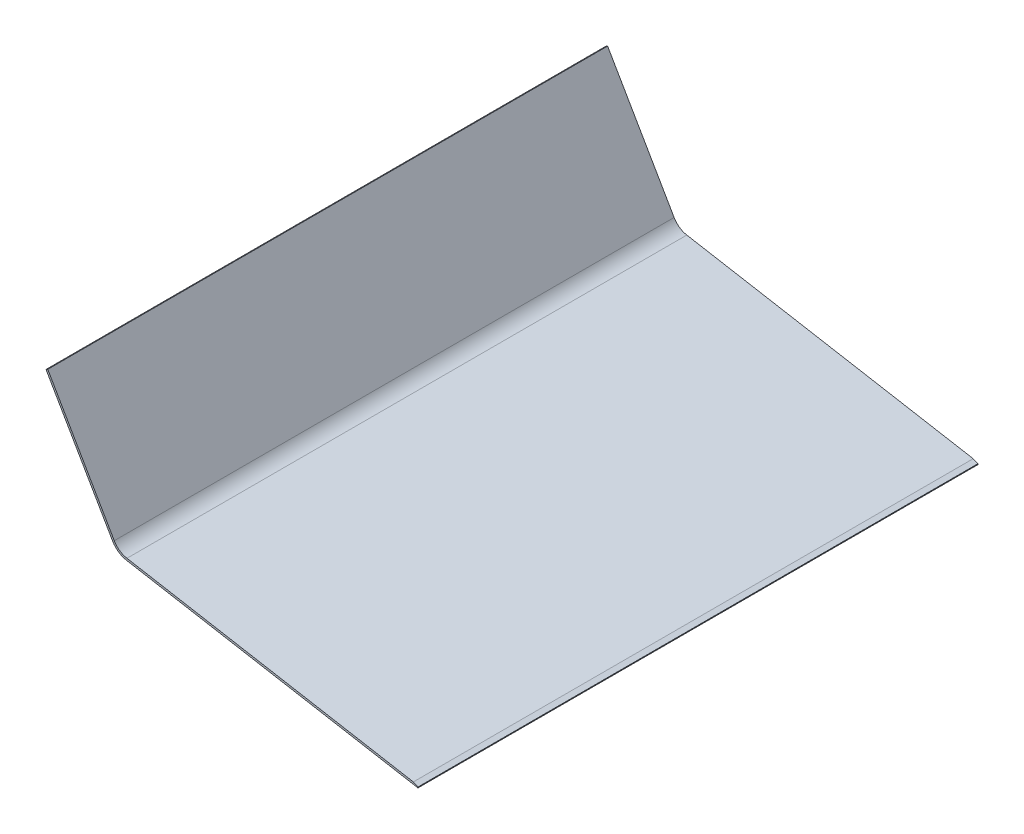
ISO-10303-21;
HEADER;
FILE_DESCRIPTION(('STEP AP214'),'2;1');
FILE_NAME('part.step','',(''),(''),'','','');
FILE_SCHEMA(('AUTOMOTIVE_DESIGN { 1 0 10303 214 1 1 1 1 }'));
ENDSEC;
DATA;
#1=APPLICATION_CONTEXT('core data for automotive mechanical design processes');
#2=APPLICATION_PROTOCOL_DEFINITION('international standard','automotive_design',2000,#1);
#3=PRODUCT_CONTEXT('',#1,'mechanical');
#4=PRODUCT('Part','Part','',(#3));
#5=PRODUCT_RELATED_PRODUCT_CATEGORY('part','',(#4));
#6=PRODUCT_DEFINITION_FORMATION('','',#4);
#7=PRODUCT_DEFINITION_CONTEXT('part definition',#1,'design');
#8=PRODUCT_DEFINITION('design','',#6,#7);
#9=PRODUCT_DEFINITION_SHAPE('','',#8);
#10=(LENGTH_UNIT() NAMED_UNIT(*) SI_UNIT(.MILLI.,.METRE.));
#11=(NAMED_UNIT(*) PLANE_ANGLE_UNIT() SI_UNIT($,.RADIAN.));
#12=(NAMED_UNIT(*) SI_UNIT($,.STERADIAN.) SOLID_ANGLE_UNIT());
#13=UNCERTAINTY_MEASURE_WITH_UNIT(LENGTH_MEASURE(1.E-05),#10,'distance_accuracy_value','');
#14=(GEOMETRIC_REPRESENTATION_CONTEXT(3) GLOBAL_UNCERTAINTY_ASSIGNED_CONTEXT((#13)) GLOBAL_UNIT_ASSIGNED_CONTEXT((#10,
#11,#12)) REPRESENTATION_CONTEXT('',''));
#15=CARTESIAN_POINT('',(0.,0.,0.));
#16=DIRECTION('',(0.,0.,1.));
#17=DIRECTION('',(1.,0.,0.));
#18=AXIS2_PLACEMENT_3D('',#15,#16,#17);
#19=CARTESIAN_POINT('',(365.442325903662,-173.338009829901,0.));
#20=DIRECTION('',(0.984807753012208,-0.173648177666931,0.));
#21=DIRECTION('',(0.,0.,-1.));
#22=AXIS2_PLACEMENT_3D('',#19,#20,#21);
#23=PLANE('',#22);
#24=DIRECTION('',(0.173648177666931,0.984807753012208,0.));
#25=VECTOR('',#24,1.);
#26=CARTESIAN_POINT('',(365.442325903662,-173.338009829901,-550.));
#27=LINE('',#26,#25);
#28=CARTESIAN_POINT('',(365.442325903662,-173.338009829901,-550.));
#29=VERTEX_POINT('',#28);
#30=CARTESIAN_POINT('',(365.615974081329,-172.353202076889,-550.));
#31=VERTEX_POINT('',#30);
#32=EDGE_CURVE('E187',#29,#31,#27,.T.);
#33=ORIENTED_EDGE('',*,*,#32,.T.);
#34=DIRECTION('',(0.,0.,1.));
#35=VECTOR('',#34,1.);
#36=CARTESIAN_POINT('',(365.615974081329,-172.353202076889,0.));
#37=LINE('',#36,#35);
#38=CARTESIAN_POINT('',(365.615974081329,-172.353202076889,0.));
#39=VERTEX_POINT('',#38);
#40=EDGE_CURVE('E49',#31,#39,#37,.T.);
#41=ORIENTED_EDGE('',*,*,#40,.T.);
#42=DIRECTION('',(0.173648177666931,0.984807753012208,0.));
#43=VECTOR('',#42,1.);
#44=CARTESIAN_POINT('',(365.442325903662,-173.338009829901,0.));
#45=LINE('',#44,#43);
#46=CARTESIAN_POINT('',(365.442325903662,-173.338009829901,0.));
#47=VERTEX_POINT('',#46);
#48=EDGE_CURVE('E189',#47,#39,#45,.T.);
#49=ORIENTED_EDGE('',*,*,#48,.F.);
#50=DIRECTION('',(0.,0.,-1.));
#51=VECTOR('',#50,1.);
#52=CARTESIAN_POINT('',(365.442325903662,-173.338009829901,0.));
#53=LINE('',#52,#51);
#54=EDGE_CURVE('E162',#47,#29,#53,.T.);
#55=ORIENTED_EDGE('',*,*,#54,.T.);
#56=EDGE_LOOP('',(#33,#41,#49,#55));
#57=FACE_BOUND('',#56,.T.);
#58=ADVANCED_FACE('F41',(#57),#23,.T.);
#59=CARTESIAN_POINT('',(0.,0.,-550.));
#60=DIRECTION('',(0.,0.,1.));
#61=DIRECTION('',(0.499999999999998,-0.86602540378444,0.));
#62=AXIS2_PLACEMENT_3D('',#59,#60,#61);
#63=PLANE('',#62);
#64=DIRECTION('',(-0.984807753012208,0.173648177666931,0.));
#65=VECTOR('',#64,1.);
#66=CARTESIAN_POINT('',(70.3472963553336,-119.273941023797,-550.));
#67=LINE('',#66,#65);
#68=CARTESIAN_POINT('',(79.5317642961338,-120.893410525212,-550.));
#69=VERTEX_POINT('',#68);
#70=CARTESIAN_POINT('',(360.865583493936,-170.500153435542,-550.));
#71=VERTEX_POINT('',#70);
#72=EDGE_CURVE('E140',#69,#71,#67,.F.);
#73=ORIENTED_EDGE('',*,*,#72,.T.);
#74=DIRECTION('',(0.93162824239654,-0.363412737764012,0.));
#75=VECTOR('',#74,1.);
#76=CARTESIAN_POINT('',(-10.0663906003716,-25.8057376854828,-550.));
#77=LINE('',#76,#75);
#78=EDGE_CURVE('E63',#71,#31,#77,.T.);
#79=ORIENTED_EDGE('',*,*,#78,.T.);
#80=ORIENTED_EDGE('',*,*,#32,.F.);
#81=DIRECTION('',(0.984807753012208,-0.173648177666931,0.));
#82=VECTOR('',#81,1.);
#83=CARTESIAN_POINT('',(69.9999999999997,-121.243556529822,-550.));
#84=LINE('',#83,#82);
#85=CARTESIAN_POINT('',(79.1844679407999,-122.863026031237,-550.));
#86=VERTEX_POINT('',#85);
#87=EDGE_CURVE('E165',#86,#29,#84,.T.);
#88=ORIENTED_EDGE('',*,*,#87,.F.);
#89=CARTESIAN_POINT('',(82.6574314941385,-103.166870970992,-550.));
#90=DIRECTION('',(0.,0.,1.));
#91=DIRECTION('',(1.,0.,0.));
#92=AXIS2_PLACEMENT_3D('',#89,#90,#91);
#93=CIRCLE('',#92,20.);
#94=CARTESIAN_POINT('',(65.3369234184498,-113.166870970992,-550.));
#95=VERTEX_POINT('',#94);
#96=EDGE_CURVE('E180',#86,#95,#93,.F.);
#97=ORIENTED_EDGE('',*,*,#96,.T.);
#98=DIRECTION('',(0.499999999999998,-0.86602540378444,0.));
#99=VECTOR('',#98,1.);
#100=CARTESIAN_POINT('',(0.,0.,-550.));
#101=LINE('',#100,#99);
#102=CARTESIAN_POINT('',(0.,0.,-550.));
#103=VERTEX_POINT('',#102);
#104=EDGE_CURVE('E166',#103,#95,#101,.T.);
#105=ORIENTED_EDGE('',*,*,#104,.F.);
#106=DIRECTION('',(0.86602540378444,0.499999999999998,0.));
#107=VECTOR('',#106,1.);
#108=CARTESIAN_POINT('',(0.,0.,-550.));
#109=LINE('',#108,#107);
#110=CARTESIAN_POINT('',(1.73205080756888,0.999999999999996,-550.));
#111=VERTEX_POINT('',#110);
#112=EDGE_CURVE('E122',#103,#111,#109,.T.);
#113=ORIENTED_EDGE('',*,*,#112,.T.);
#114=DIRECTION('',(-0.499999999999998,0.86602540378444,0.));
#115=VECTOR('',#114,1.);
#116=CARTESIAN_POINT('',(1.73205080756888,0.999999999999996,-550.));
#117=LINE('',#116,#115);
#118=CARTESIAN_POINT('',(67.0689742260186,-112.166870970992,-550.));
#119=VERTEX_POINT('',#118);
#120=EDGE_CURVE('E132',#111,#119,#117,.F.);
#121=ORIENTED_EDGE('',*,*,#120,.T.);
#122=CARTESIAN_POINT('',(82.6574314941385,-103.166870970992,-550.));
#123=DIRECTION('',(0.,0.,1.));
#124=DIRECTION('',(1.,0.,0.));
#125=AXIS2_PLACEMENT_3D('',#122,#123,#124);
#126=CIRCLE('',#125,18.);
#127=EDGE_CURVE('E149',#69,#119,#126,.F.);
#128=ORIENTED_EDGE('',*,*,#127,.F.);
#129=EDGE_LOOP('',(#73,#79,#80,#88,#97,#105,#113,#121,#128));
#130=FACE_BOUND('',#129,.T.);
#131=ADVANCED_FACE('F201',(#130),#63,.F.);
#132=CARTESIAN_POINT('',(0.,0.,0.));
#133=DIRECTION('',(0.499999999999998,-0.86602540378444,0.));
#134=DIRECTION('',(0.,0.,-1.));
#135=AXIS2_PLACEMENT_3D('',#132,#133,#134);
#136=PLANE('',#135);
#137=ORIENTED_EDGE('',*,*,#112,.F.);
#138=DIRECTION('',(0.,0.,-1.));
#139=VECTOR('',#138,1.);
#140=CARTESIAN_POINT('',(0.,0.,0.));
#141=LINE('',#140,#139);
#142=CARTESIAN_POINT('',(0.,0.,0.));
#143=VERTEX_POINT('',#142);
#144=EDGE_CURVE('E117',#143,#103,#141,.T.);
#145=ORIENTED_EDGE('',*,*,#144,.F.);
#146=DIRECTION('',(0.86602540378444,0.499999999999998,0.));
#147=VECTOR('',#146,1.);
#148=CARTESIAN_POINT('',(0.,0.,0.));
#149=LINE('',#148,#147);
#150=CARTESIAN_POINT('',(1.73205080756888,0.999999999999996,0.));
#151=VERTEX_POINT('',#150);
#152=EDGE_CURVE('E112',#143,#151,#149,.T.);
#153=ORIENTED_EDGE('',*,*,#152,.T.);
#154=DIRECTION('',(0.,0.,1.));
#155=VECTOR('',#154,1.);
#156=CARTESIAN_POINT('',(1.73205080756888,0.999999999999996,0.));
#157=LINE('',#156,#155);
#158=EDGE_CURVE('E115',#151,#111,#157,.F.);
#159=ORIENTED_EDGE('',*,*,#158,.T.);
#160=EDGE_LOOP('',(#137,#145,#153,#159));
#161=FACE_BOUND('',#160,.T.);
#162=ADVANCED_FACE('F114',(#161),#136,.F.);
#163=CARTESIAN_POINT('',(82.6574314941385,-103.166870970992,0.));
#164=DIRECTION('',(0.,0.,1.));
#165=DIRECTION('',(1.,0.,0.));
#166=AXIS2_PLACEMENT_3D('',#163,#164,#165);
#167=PLANE('',#166);
#168=ORIENTED_EDGE('',*,*,#48,.T.);
#169=DIRECTION('',(0.93162824239654,-0.363412737764012,0.));
#170=VECTOR('',#169,1.);
#171=CARTESIAN_POINT('',(96.6033221106094,-67.4158248089453,0.));
#172=LINE('',#171,#170);
#173=CARTESIAN_POINT('',(360.865583493935,-170.500153435542,0.));
#174=VERTEX_POINT('',#173);
#175=EDGE_CURVE('E11',#39,#174,#172,.F.);
#176=ORIENTED_EDGE('',*,*,#175,.T.);
#177=DIRECTION('',(-0.984807753012208,0.173648177666931,0.));
#178=VECTOR('',#177,1.);
#179=CARTESIAN_POINT('',(70.3472963553336,-119.273941023797,0.));
#180=LINE('',#179,#178);
#181=CARTESIAN_POINT('',(79.5317642961338,-120.893410525212,0.));
#182=VERTEX_POINT('',#181);
#183=EDGE_CURVE('E134',#182,#174,#180,.F.);
#184=ORIENTED_EDGE('',*,*,#183,.F.);
#185=CARTESIAN_POINT('',(82.6574314941385,-103.166870970992,0.));
#186=DIRECTION('',(0.,0.,1.));
#187=DIRECTION('',(1.,0.,0.));
#188=AXIS2_PLACEMENT_3D('',#185,#186,#187);
#189=CIRCLE('',#188,18.);
#190=CARTESIAN_POINT('',(67.0689742260187,-112.166870970992,0.));
#191=VERTEX_POINT('',#190);
#192=EDGE_CURVE('E138',#191,#182,#189,.T.);
#193=ORIENTED_EDGE('',*,*,#192,.F.);
#194=DIRECTION('',(-0.499999999999998,0.86602540378444,0.));
#195=VECTOR('',#194,1.);
#196=CARTESIAN_POINT('',(1.73205080756888,0.999999999999996,0.));
#197=LINE('',#196,#195);
#198=EDGE_CURVE('E129',#151,#191,#197,.F.);
#199=ORIENTED_EDGE('',*,*,#198,.F.);
#200=ORIENTED_EDGE('',*,*,#152,.F.);
#201=DIRECTION('',(0.499999999999998,-0.86602540378444,0.));
#202=VECTOR('',#201,1.);
#203=CARTESIAN_POINT('',(0.,0.,0.));
#204=LINE('',#203,#202);
#205=CARTESIAN_POINT('',(65.3369234184497,-113.166870970992,0.));
#206=VERTEX_POINT('',#205);
#207=EDGE_CURVE('E163',#143,#206,#204,.T.);
#208=ORIENTED_EDGE('',*,*,#207,.T.);
#209=CARTESIAN_POINT('',(82.6574314941385,-103.166870970992,0.));
#210=DIRECTION('',(0.,0.,-1.));
#211=DIRECTION('',(-1.,0.,0.));
#212=AXIS2_PLACEMENT_3D('',#209,#210,#211);
#213=CIRCLE('',#212,20.);
#214=CARTESIAN_POINT('',(79.1844679407999,-122.863026031237,0.));
#215=VERTEX_POINT('',#214);
#216=EDGE_CURVE('E170',#206,#215,#213,.F.);
#217=ORIENTED_EDGE('',*,*,#216,.T.);
#218=DIRECTION('',(0.984807753012208,-0.173648177666931,0.));
#219=VECTOR('',#218,1.);
#220=CARTESIAN_POINT('',(69.9999999999997,-121.243556529822,0.));
#221=LINE('',#220,#219);
#222=EDGE_CURVE('E157',#215,#47,#221,.T.);
#223=ORIENTED_EDGE('',*,*,#222,.T.);
#224=EDGE_LOOP('',(#168,#176,#184,#193,#199,#200,#208,#217,#223));
#225=FACE_BOUND('',#224,.T.);
#226=ADVANCED_FACE('F136',(#225),#167,.T.);
#227=CARTESIAN_POINT('',(1.73205080756888,0.999999999999996,0.));
#228=DIRECTION('',(0.86602540378444,0.499999999999998,0.));
#229=DIRECTION('',(-0.499999999999998,0.86602540378444,0.));
#230=AXIS2_PLACEMENT_3D('',#227,#228,#229);
#231=PLANE('',#230);
#232=ORIENTED_EDGE('',*,*,#198,.T.);
#233=DIRECTION('',(0.,0.,1.));
#234=VECTOR('',#233,1.);
#235=CARTESIAN_POINT('',(67.0689742260187,-112.166870970992,0.));
#236=LINE('',#235,#234);
#237=EDGE_CURVE('E155',#191,#119,#236,.F.);
#238=ORIENTED_EDGE('',*,*,#237,.T.);
#239=ORIENTED_EDGE('',*,*,#120,.F.);
#240=ORIENTED_EDGE('',*,*,#158,.F.);
#241=EDGE_LOOP('',(#232,#238,#239,#240));
#242=FACE_BOUND('',#241,.T.);
#243=ADVANCED_FACE('F127',(#242),#231,.T.);
#244=CARTESIAN_POINT('',(70.3472963553336,-119.273941023797,0.));
#245=DIRECTION('',(0.173648177666931,0.984807753012208,0.));
#246=DIRECTION('',(-0.984807753012208,0.173648177666931,0.));
#247=AXIS2_PLACEMENT_3D('',#244,#245,#246);
#248=PLANE('',#247);
#249=ORIENTED_EDGE('',*,*,#183,.T.);
#250=DIRECTION('',(0.,0.,-1.));
#251=VECTOR('',#250,1.);
#252=CARTESIAN_POINT('',(360.865583493935,-170.500153435542,0.));
#253=LINE('',#252,#251);
#254=EDGE_CURVE('E191',#174,#71,#253,.T.);
#255=ORIENTED_EDGE('',*,*,#254,.T.);
#256=ORIENTED_EDGE('',*,*,#72,.F.);
#257=DIRECTION('',(0.,0.,1.));
#258=VECTOR('',#257,1.);
#259=CARTESIAN_POINT('',(79.5317642961338,-120.893410525212,0.));
#260=LINE('',#259,#258);
#261=EDGE_CURVE('E123',#69,#182,#260,.T.);
#262=ORIENTED_EDGE('',*,*,#261,.T.);
#263=EDGE_LOOP('',(#249,#255,#256,#262));
#264=FACE_BOUND('',#263,.T.);
#265=ADVANCED_FACE('F196',(#264),#248,.T.);
#266=CARTESIAN_POINT('',(82.6574314941385,-103.166870970992,0.));
#267=DIRECTION('',(0.,0.,1.));
#268=DIRECTION('',(1.,0.,0.));
#269=AXIS2_PLACEMENT_3D('',#266,#267,#268);
#270=CYLINDRICAL_SURFACE('',#269,18.);
#271=ORIENTED_EDGE('',*,*,#192,.T.);
#272=ORIENTED_EDGE('',*,*,#261,.F.);
#273=ORIENTED_EDGE('',*,*,#127,.T.);
#274=ORIENTED_EDGE('',*,*,#237,.F.);
#275=EDGE_LOOP('',(#271,#272,#273,#274));
#276=FACE_BOUND('',#275,.T.);
#277=ADVANCED_FACE('F204',(#276),#270,.F.);
#278=CARTESIAN_POINT('',(0.,0.,0.));
#279=DIRECTION('',(0.86602540378444,0.499999999999998,0.));
#280=DIRECTION('',(-0.499999999999998,0.86602540378444,0.));
#281=AXIS2_PLACEMENT_3D('',#278,#279,#280);
#282=PLANE('',#281);
#283=ORIENTED_EDGE('',*,*,#207,.F.);
#284=ORIENTED_EDGE('',*,*,#144,.T.);
#285=ORIENTED_EDGE('',*,*,#104,.T.);
#286=DIRECTION('',(0.,0.,-1.));
#287=VECTOR('',#286,1.);
#288=CARTESIAN_POINT('',(65.3369234184497,-113.166870970992,-550.));
#289=LINE('',#288,#287);
#290=EDGE_CURVE('E161',#206,#95,#289,.T.);
#291=ORIENTED_EDGE('',*,*,#290,.F.);
#292=EDGE_LOOP('',(#283,#284,#285,#291));
#293=FACE_BOUND('',#292,.T.);
#294=ADVANCED_FACE('F229',(#293),#282,.F.);
#295=CARTESIAN_POINT('',(69.9999999999997,-121.243556529822,0.));
#296=DIRECTION('',(0.173648177666931,0.984807753012208,0.));
#297=DIRECTION('',(-0.984807753012208,0.173648177666931,0.));
#298=AXIS2_PLACEMENT_3D('',#295,#296,#297);
#299=PLANE('',#298);
#300=ORIENTED_EDGE('',*,*,#87,.T.);
#301=ORIENTED_EDGE('',*,*,#54,.F.);
#302=ORIENTED_EDGE('',*,*,#222,.F.);
#303=DIRECTION('',(0.,0.,-1.));
#304=VECTOR('',#303,1.);
#305=CARTESIAN_POINT('',(79.1844679407999,-122.863026031237,0.));
#306=LINE('',#305,#304);
#307=EDGE_CURVE('E150',#86,#215,#306,.F.);
#308=ORIENTED_EDGE('',*,*,#307,.F.);
#309=EDGE_LOOP('',(#300,#301,#302,#308));
#310=FACE_BOUND('',#309,.T.);
#311=ADVANCED_FACE('F210',(#310),#299,.F.);
#312=CARTESIAN_POINT('',(82.6574314941385,-103.166870970992,0.));
#313=DIRECTION('',(0.,0.,1.));
#314=DIRECTION('',(1.,0.,0.));
#315=AXIS2_PLACEMENT_3D('',#312,#313,#314);
#316=CYLINDRICAL_SURFACE('',#315,20.);
#317=ORIENTED_EDGE('',*,*,#216,.F.);
#318=ORIENTED_EDGE('',*,*,#290,.T.);
#319=ORIENTED_EDGE('',*,*,#96,.F.);
#320=ORIENTED_EDGE('',*,*,#307,.T.);
#321=EDGE_LOOP('',(#317,#318,#319,#320));
#322=FACE_BOUND('',#321,.T.);
#323=ADVANCED_FACE('F206',(#322),#316,.T.);
#324=CARTESIAN_POINT('',(360.865583493935,-170.500153435542,0.));
#325=DIRECTION('',(-0.363412737764012,-0.931628242396539,0.));
#326=DIRECTION('',(0.93162824239654,-0.363412737764012,0.));
#327=AXIS2_PLACEMENT_3D('',#324,#325,#326);
#328=PLANE('',#327);
#329=ORIENTED_EDGE('',*,*,#175,.F.);
#330=ORIENTED_EDGE('',*,*,#40,.F.);
#331=ORIENTED_EDGE('',*,*,#78,.F.);
#332=ORIENTED_EDGE('',*,*,#254,.F.);
#333=EDGE_LOOP('',(#329,#330,#331,#332));
#334=FACE_BOUND('',#333,.T.);
#335=ADVANCED_FACE('F43',(#334),#328,.F.);
#336=CLOSED_SHELL('',(#58,#131,#162,#226,#243,#265,#277,#294,#311,#323,#335));
#337=MANIFOLD_SOLID_BREP('B2',#336);
#338=ADVANCED_BREP_SHAPE_REPRESENTATION('',(#18,#337),#14);
#339=SHAPE_DEFINITION_REPRESENTATION(#9,#338);
ENDSEC;
END-ISO-10303-21;
